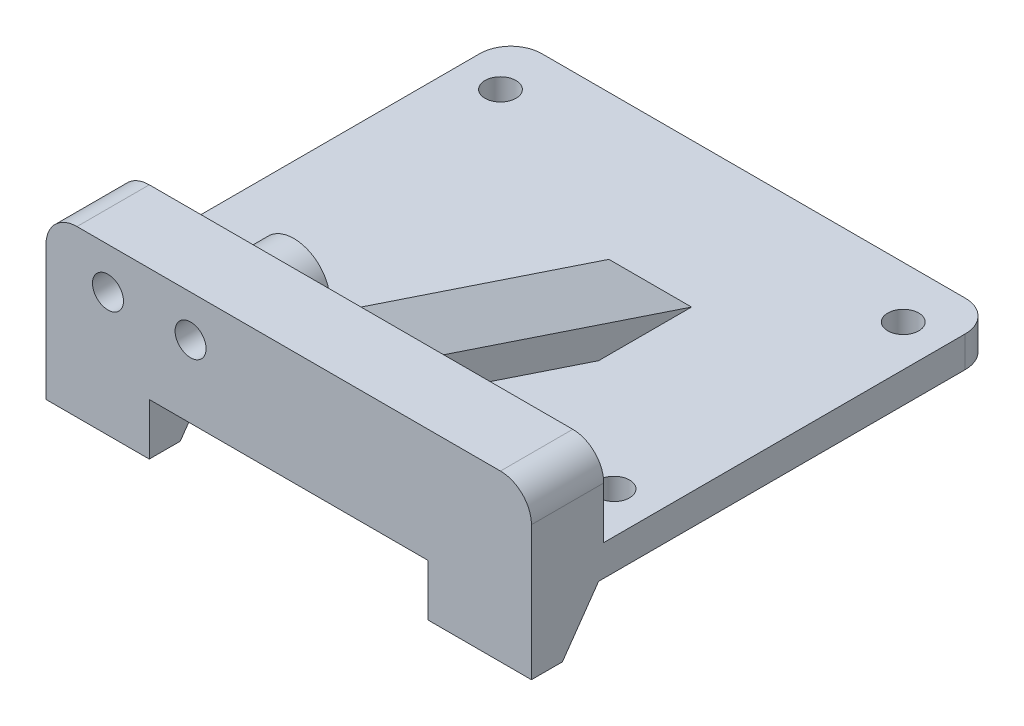
ISO-10303-21;
HEADER;
FILE_DESCRIPTION(('STEP AP214'),'2;1');
FILE_NAME('part.step','',(''),(''),'','','');
FILE_SCHEMA(('AUTOMOTIVE_DESIGN { 1 0 10303 214 1 1 1 1 }'));
ENDSEC;
DATA;
#1=APPLICATION_CONTEXT('core data for automotive mechanical design processes');
#2=APPLICATION_PROTOCOL_DEFINITION('international standard','automotive_design',2000,#1);
#3=PRODUCT_CONTEXT('',#1,'mechanical');
#4=PRODUCT('Part','Part','',(#3));
#5=PRODUCT_RELATED_PRODUCT_CATEGORY('part','',(#4));
#6=PRODUCT_DEFINITION_FORMATION('','',#4);
#7=PRODUCT_DEFINITION_CONTEXT('part definition',#1,'design');
#8=PRODUCT_DEFINITION('design','',#6,#7);
#9=PRODUCT_DEFINITION_SHAPE('','',#8);
#10=(LENGTH_UNIT() NAMED_UNIT(*) SI_UNIT(.MILLI.,.METRE.));
#11=(NAMED_UNIT(*) PLANE_ANGLE_UNIT() SI_UNIT($,.RADIAN.));
#12=(NAMED_UNIT(*) SI_UNIT($,.STERADIAN.) SOLID_ANGLE_UNIT());
#13=UNCERTAINTY_MEASURE_WITH_UNIT(LENGTH_MEASURE(1.E-05),#10,'distance_accuracy_value','');
#14=(GEOMETRIC_REPRESENTATION_CONTEXT(3) GLOBAL_UNCERTAINTY_ASSIGNED_CONTEXT((#13)) GLOBAL_UNIT_ASSIGNED_CONTEXT((#10,
#11,#12)) REPRESENTATION_CONTEXT('',''));
#15=CARTESIAN_POINT('',(0.,0.,0.));
#16=DIRECTION('',(0.,0.,1.));
#17=DIRECTION('',(1.,0.,0.));
#18=AXIS2_PLACEMENT_3D('',#15,#16,#17);
#19=CARTESIAN_POINT('',(0.,0.,19.));
#20=DIRECTION('',(0.,0.,1.));
#21=DIRECTION('',(1.,0.,0.));
#22=AXIS2_PLACEMENT_3D('',#19,#20,#21);
#23=PLANE('',#22);
#24=DIRECTION('',(0.,1.,0.));
#25=VECTOR('',#24,1.);
#26=CARTESIAN_POINT('',(-23.5,0.,19.));
#27=LINE('',#26,#25);
#28=CARTESIAN_POINT('',(-23.5,3.,19.));
#29=VERTEX_POINT('',#28);
#30=CARTESIAN_POINT('',(-23.5,8.00000000000001,19.));
#31=VERTEX_POINT('',#30);
#32=EDGE_CURVE('E273',#29,#31,#27,.T.);
#33=ORIENTED_EDGE('',*,*,#32,.T.);
#34=CARTESIAN_POINT('',(-20.5,8.00000000000001,19.));
#35=DIRECTION('',(0.,0.,1.));
#36=DIRECTION('',(1.,0.,0.));
#37=AXIS2_PLACEMENT_3D('',#34,#35,#36);
#38=CIRCLE('',#37,3.);
#39=CARTESIAN_POINT('',(-20.5,11.,19.));
#40=VERTEX_POINT('',#39);
#41=EDGE_CURVE('E350',#31,#40,#38,.F.);
#42=ORIENTED_EDGE('',*,*,#41,.T.);
#43=DIRECTION('',(1.,0.,0.));
#44=VECTOR('',#43,1.);
#45=CARTESIAN_POINT('',(0.,11.,19.));
#46=LINE('',#45,#44);
#47=CARTESIAN_POINT('',(0.,11.,19.));
#48=VERTEX_POINT('',#47);
#49=EDGE_CURVE('E282',#40,#48,#46,.T.);
#50=ORIENTED_EDGE('',*,*,#49,.T.);
#51=DIRECTION('',(0.,-1.,0.));
#52=VECTOR('',#51,1.);
#53=CARTESIAN_POINT('',(0.,11.,19.));
#54=LINE('',#53,#52);
#55=CARTESIAN_POINT('',(0.,8.,19.));
#56=VERTEX_POINT('',#55);
#57=EDGE_CURVE('E435',#48,#56,#54,.T.);
#58=ORIENTED_EDGE('',*,*,#57,.T.);
#59=DIRECTION('',(-1.,0.,0.));
#60=VECTOR('',#59,1.);
#61=CARTESIAN_POINT('',(8.,8.,19.));
#62=LINE('',#61,#60);
#63=CARTESIAN_POINT('',(8.,8.,19.));
#64=VERTEX_POINT('',#63);
#65=EDGE_CURVE('E451',#64,#56,#62,.T.);
#66=ORIENTED_EDGE('',*,*,#65,.F.);
#67=DIRECTION('',(0.,-1.,0.));
#68=VECTOR('',#67,1.);
#69=CARTESIAN_POINT('',(8.,11.,19.));
#70=LINE('',#69,#68);
#71=CARTESIAN_POINT('',(8.,11.,19.));
#72=VERTEX_POINT('',#71);
#73=EDGE_CURVE('E418',#72,#64,#70,.T.);
#74=ORIENTED_EDGE('',*,*,#73,.F.);
#75=CARTESIAN_POINT('',(20.5,11.,19.));
#76=VERTEX_POINT('',#75);
#77=EDGE_CURVE('E281',#72,#76,#46,.T.);
#78=ORIENTED_EDGE('',*,*,#77,.T.);
#79=CARTESIAN_POINT('',(20.5,7.99999999999999,19.));
#80=DIRECTION('',(0.,0.,1.));
#81=DIRECTION('',(1.,0.,0.));
#82=AXIS2_PLACEMENT_3D('',#79,#80,#81);
#83=CIRCLE('',#82,3.);
#84=CARTESIAN_POINT('',(23.5,7.99999999999999,19.));
#85=VERTEX_POINT('',#84);
#86=EDGE_CURVE('E347',#76,#85,#83,.F.);
#87=ORIENTED_EDGE('',*,*,#86,.T.);
#88=DIRECTION('',(0.,-1.,0.));
#89=VECTOR('',#88,1.);
#90=CARTESIAN_POINT('',(23.5,0.,19.));
#91=LINE('',#90,#89);
#92=CARTESIAN_POINT('',(23.5,3.,19.));
#93=VERTEX_POINT('',#92);
#94=EDGE_CURVE('E277',#85,#93,#91,.T.);
#95=ORIENTED_EDGE('',*,*,#94,.T.);
#96=DIRECTION('',(1.,0.,0.));
#97=VECTOR('',#96,1.);
#98=CARTESIAN_POINT('',(0.,3.,19.));
#99=LINE('',#98,#97);
#100=EDGE_CURVE('E297',#29,#93,#99,.T.);
#101=ORIENTED_EDGE('',*,*,#100,.F.);
#102=EDGE_LOOP('',(#33,#42,#50,#58,#66,#74,#78,#87,#95,#101));
#103=FACE_BOUND('',#102,.T.);
#104=CARTESIAN_POINT('',(-17.5,7.,19.));
#105=DIRECTION('',(0.,0.,1.));
#106=DIRECTION('',(1.,0.,0.));
#107=AXIS2_PLACEMENT_3D('',#104,#105,#106);
#108=CIRCLE('',#107,1.5);
#109=CARTESIAN_POINT('',(-16.,7.,19.));
#110=VERTEX_POINT('',#109);
#111=EDGE_CURVE('E257',#110,#110,#108,.F.);
#112=ORIENTED_EDGE('',*,*,#111,.F.);
#113=EDGE_LOOP('',(#112));
#114=FACE_BOUND('',#113,.T.);
#115=CARTESIAN_POINT('',(-9.50000000000001,7.,19.));
#116=DIRECTION('',(0.,0.,1.));
#117=DIRECTION('',(1.,0.,0.));
#118=AXIS2_PLACEMENT_3D('',#115,#116,#117);
#119=CIRCLE('',#118,3.5);
#120=CARTESIAN_POINT('',(-6.00000000000001,7.,19.));
#121=VERTEX_POINT('',#120);
#122=EDGE_CURVE('E12',#121,#121,#119,.F.);
#123=ORIENTED_EDGE('',*,*,#122,.F.);
#124=EDGE_LOOP('',(#123));
#125=FACE_BOUND('',#124,.T.);
#126=ADVANCED_FACE('F75',(#103,#114,#125),#23,.F.);
#127=CARTESIAN_POINT('',(0.,0.,0.));
#128=DIRECTION('',(0.,1.,0.));
#129=DIRECTION('',(0.,0.,1.));
#130=AXIS2_PLACEMENT_3D('',#127,#128,#129);
#131=PLANE('',#130);
#132=CARTESIAN_POINT('',(-19.5,0.,-14.));
#133=DIRECTION('',(0.,1.,0.));
#134=DIRECTION('',(0.,0.,1.));
#135=AXIS2_PLACEMENT_3D('',#132,#133,#134);
#136=CIRCLE('',#135,1.5);
#137=CARTESIAN_POINT('',(-19.5,0.,-12.5));
#138=VERTEX_POINT('',#137);
#139=EDGE_CURVE('E293',#138,#138,#136,.F.);
#140=ORIENTED_EDGE('',*,*,#139,.F.);
#141=EDGE_LOOP('',(#140));
#142=FACE_BOUND('',#141,.T.);
#143=CARTESIAN_POINT('',(-19.5,0.,14.));
#144=DIRECTION('',(0.,1.,0.));
#145=DIRECTION('',(0.,0.,1.));
#146=AXIS2_PLACEMENT_3D('',#143,#144,#145);
#147=CIRCLE('',#146,1.5);
#148=CARTESIAN_POINT('',(-19.5,0.,15.5));
#149=VERTEX_POINT('',#148);
#150=EDGE_CURVE('E337',#149,#149,#147,.T.);
#151=ORIENTED_EDGE('',*,*,#150,.T.);
#152=EDGE_LOOP('',(#151));
#153=FACE_BOUND('',#152,.T.);
#154=CARTESIAN_POINT('',(19.5,0.,-14.));
#155=DIRECTION('',(0.,1.,0.));
#156=DIRECTION('',(0.,0.,1.));
#157=AXIS2_PLACEMENT_3D('',#154,#155,#156);
#158=CIRCLE('',#157,1.5);
#159=CARTESIAN_POINT('',(19.5,0.,-12.5));
#160=VERTEX_POINT('',#159);
#161=EDGE_CURVE('E323',#160,#160,#158,.T.);
#162=ORIENTED_EDGE('',*,*,#161,.T.);
#163=EDGE_LOOP('',(#162));
#164=FACE_BOUND('',#163,.T.);
#165=CARTESIAN_POINT('',(19.5,0.,14.));
#166=DIRECTION('',(0.,1.,0.));
#167=DIRECTION('',(0.,0.,1.));
#168=AXIS2_PLACEMENT_3D('',#165,#166,#167);
#169=CIRCLE('',#168,1.5);
#170=CARTESIAN_POINT('',(19.5,0.,15.5));
#171=VERTEX_POINT('',#170);
#172=EDGE_CURVE('E272',#171,#171,#169,.F.);
#173=ORIENTED_EDGE('',*,*,#172,.F.);
#174=EDGE_LOOP('',(#173));
#175=FACE_BOUND('',#174,.T.);
#176=DIRECTION('',(1.,0.,0.));
#177=VECTOR('',#176,1.);
#178=CARTESIAN_POINT('',(0.,0.,-19.));
#179=LINE('',#178,#177);
#180=CARTESIAN_POINT('',(-20.5,0.,-19.));
#181=VERTEX_POINT('',#180);
#182=CARTESIAN_POINT('',(20.5,0.,-19.));
#183=VERTEX_POINT('',#182);
#184=EDGE_CURVE('E330',#181,#183,#179,.T.);
#185=ORIENTED_EDGE('',*,*,#184,.T.);
#186=CARTESIAN_POINT('',(20.5,0.,-16.));
#187=DIRECTION('',(0.,1.,0.));
#188=DIRECTION('',(0.,0.,1.));
#189=AXIS2_PLACEMENT_3D('',#186,#187,#188);
#190=CIRCLE('',#189,3.);
#191=CARTESIAN_POINT('',(23.5,0.,-16.));
#192=VERTEX_POINT('',#191);
#193=EDGE_CURVE('E379',#183,#192,#190,.F.);
#194=ORIENTED_EDGE('',*,*,#193,.T.);
#195=DIRECTION('',(0.,0.,-1.));
#196=VECTOR('',#195,1.);
#197=CARTESIAN_POINT('',(23.5,0.,0.));
#198=LINE('',#197,#196);
#199=CARTESIAN_POINT('',(23.5,0.,19.5));
#200=VERTEX_POINT('',#199);
#201=EDGE_CURVE('E327',#200,#192,#198,.T.);
#202=ORIENTED_EDGE('',*,*,#201,.F.);
#203=DIRECTION('',(1.,0.,0.));
#204=VECTOR('',#203,1.);
#205=CARTESIAN_POINT('',(13.5,0.,19.5));
#206=LINE('',#205,#204);
#207=CARTESIAN_POINT('',(13.5,0.,19.5));
#208=VERTEX_POINT('',#207);
#209=EDGE_CURVE('E238',#208,#200,#206,.T.);
#210=ORIENTED_EDGE('',*,*,#209,.F.);
#211=DIRECTION('',(0.,0.,-1.));
#212=VECTOR('',#211,1.);
#213=CARTESIAN_POINT('',(13.5,0.,19.5));
#214=LINE('',#213,#212);
#215=CARTESIAN_POINT('',(13.5,0.,26.));
#216=VERTEX_POINT('',#215);
#217=EDGE_CURVE('E220',#216,#208,#214,.T.);
#218=ORIENTED_EDGE('',*,*,#217,.F.);
#219=DIRECTION('',(1.,0.,0.));
#220=VECTOR('',#219,1.);
#221=CARTESIAN_POINT('',(0.,0.,26.));
#222=LINE('',#221,#220);
#223=CARTESIAN_POINT('',(-13.5,0.,26.));
#224=VERTEX_POINT('',#223);
#225=EDGE_CURVE('E235',#224,#216,#222,.T.);
#226=ORIENTED_EDGE('',*,*,#225,.F.);
#227=DIRECTION('',(0.,0.,-1.));
#228=VECTOR('',#227,1.);
#229=CARTESIAN_POINT('',(-13.5,0.,19.5));
#230=LINE('',#229,#228);
#231=CARTESIAN_POINT('',(-13.5,0.,19.5));
#232=VERTEX_POINT('',#231);
#233=EDGE_CURVE('E400',#224,#232,#230,.T.);
#234=ORIENTED_EDGE('',*,*,#233,.T.);
#235=DIRECTION('',(-1.,0.,0.));
#236=VECTOR('',#235,1.);
#237=CARTESIAN_POINT('',(-13.5,0.,19.5));
#238=LINE('',#237,#236);
#239=CARTESIAN_POINT('',(-23.5,0.,19.5));
#240=VERTEX_POINT('',#239);
#241=EDGE_CURVE('E399',#232,#240,#238,.T.);
#242=ORIENTED_EDGE('',*,*,#241,.T.);
#243=DIRECTION('',(0.,0.,-1.));
#244=VECTOR('',#243,1.);
#245=CARTESIAN_POINT('',(-23.5,0.,0.));
#246=LINE('',#245,#244);
#247=CARTESIAN_POINT('',(-23.5,0.,-16.));
#248=VERTEX_POINT('',#247);
#249=EDGE_CURVE('E333',#240,#248,#246,.T.);
#250=ORIENTED_EDGE('',*,*,#249,.T.);
#251=CARTESIAN_POINT('',(-20.5,0.,-16.));
#252=DIRECTION('',(0.,1.,0.));
#253=DIRECTION('',(0.,0.,1.));
#254=AXIS2_PLACEMENT_3D('',#251,#252,#253);
#255=CIRCLE('',#254,3.);
#256=EDGE_CURVE('E376',#248,#181,#255,.F.);
#257=ORIENTED_EDGE('',*,*,#256,.T.);
#258=EDGE_LOOP('',(#185,#194,#202,#210,#218,#226,#234,#242,#250,#257));
#259=FACE_BOUND('',#258,.T.);
#260=ADVANCED_FACE('F233',(#142,#153,#164,#175,#259),#131,.F.);
#261=CARTESIAN_POINT('',(0.,3.,0.));
#262=DIRECTION('',(0.,1.,0.));
#263=DIRECTION('',(0.,0.,1.));
#264=AXIS2_PLACEMENT_3D('',#261,#262,#263);
#265=PLANE('',#264);
#266=CARTESIAN_POINT('',(19.5,3.,14.));
#267=DIRECTION('',(0.,1.,0.));
#268=DIRECTION('',(0.,0.,1.));
#269=AXIS2_PLACEMENT_3D('',#266,#267,#268);
#270=CIRCLE('',#269,1.5);
#271=CARTESIAN_POINT('',(19.5,3.,15.5));
#272=VERTEX_POINT('',#271);
#273=EDGE_CURVE('E288',#272,#272,#270,.F.);
#274=ORIENTED_EDGE('',*,*,#273,.T.);
#275=EDGE_LOOP('',(#274));
#276=FACE_BOUND('',#275,.T.);
#277=CARTESIAN_POINT('',(19.5,3.,-14.));
#278=DIRECTION('',(0.,1.,0.));
#279=DIRECTION('',(0.,0.,1.));
#280=AXIS2_PLACEMENT_3D('',#277,#278,#279);
#281=CIRCLE('',#280,1.5);
#282=CARTESIAN_POINT('',(19.5,3.,-12.5));
#283=VERTEX_POINT('',#282);
#284=EDGE_CURVE('E292',#283,#283,#281,.T.);
#285=ORIENTED_EDGE('',*,*,#284,.F.);
#286=EDGE_LOOP('',(#285));
#287=FACE_BOUND('',#286,.T.);
#288=DIRECTION('',(0.,0.,-1.));
#289=VECTOR('',#288,1.);
#290=CARTESIAN_POINT('',(23.5,3.,0.));
#291=LINE('',#290,#289);
#292=CARTESIAN_POINT('',(23.5,3.,-16.));
#293=VERTEX_POINT('',#292);
#294=EDGE_CURVE('E301',#93,#293,#291,.T.);
#295=ORIENTED_EDGE('',*,*,#294,.T.);
#296=CARTESIAN_POINT('',(20.5,3.,-16.));
#297=DIRECTION('',(0.,1.,0.));
#298=DIRECTION('',(0.,0.,1.));
#299=AXIS2_PLACEMENT_3D('',#296,#297,#298);
#300=CIRCLE('',#299,3.);
#301=CARTESIAN_POINT('',(20.5,3.,-19.));
#302=VERTEX_POINT('',#301);
#303=EDGE_CURVE('E386',#293,#302,#300,.T.);
#304=ORIENTED_EDGE('',*,*,#303,.T.);
#305=DIRECTION('',(1.,0.,0.));
#306=VECTOR('',#305,1.);
#307=CARTESIAN_POINT('',(0.,3.,-19.));
#308=LINE('',#307,#306);
#309=CARTESIAN_POINT('',(-20.5,3.,-19.));
#310=VERTEX_POINT('',#309);
#311=EDGE_CURVE('E304',#310,#302,#308,.T.);
#312=ORIENTED_EDGE('',*,*,#311,.F.);
#313=CARTESIAN_POINT('',(-20.5,3.,-16.));
#314=DIRECTION('',(0.,1.,0.));
#315=DIRECTION('',(0.,0.,1.));
#316=AXIS2_PLACEMENT_3D('',#313,#314,#315);
#317=CIRCLE('',#316,3.);
#318=CARTESIAN_POINT('',(-23.5,3.,-16.));
#319=VERTEX_POINT('',#318);
#320=EDGE_CURVE('E91',#310,#319,#317,.T.);
#321=ORIENTED_EDGE('',*,*,#320,.T.);
#322=DIRECTION('',(0.,0.,-1.));
#323=VECTOR('',#322,1.);
#324=CARTESIAN_POINT('',(-23.5,3.,0.));
#325=LINE('',#324,#323);
#326=EDGE_CURVE('E308',#29,#319,#325,.T.);
#327=ORIENTED_EDGE('',*,*,#326,.F.);
#328=ORIENTED_EDGE('',*,*,#100,.T.);
#329=EDGE_LOOP('',(#295,#304,#312,#321,#327,#328));
#330=FACE_BOUND('',#329,.T.);
#331=CARTESIAN_POINT('',(-19.5,3.,14.));
#332=DIRECTION('',(0.,1.,0.));
#333=DIRECTION('',(0.,0.,1.));
#334=AXIS2_PLACEMENT_3D('',#331,#332,#333);
#335=CIRCLE('',#334,1.5);
#336=CARTESIAN_POINT('',(-19.5,3.,15.5));
#337=VERTEX_POINT('',#336);
#338=EDGE_CURVE('E311',#337,#337,#335,.T.);
#339=ORIENTED_EDGE('',*,*,#338,.F.);
#340=EDGE_LOOP('',(#339));
#341=FACE_BOUND('',#340,.T.);
#342=CARTESIAN_POINT('',(-19.5,3.,-14.));
#343=DIRECTION('',(0.,1.,0.));
#344=DIRECTION('',(0.,0.,1.));
#345=AXIS2_PLACEMENT_3D('',#342,#343,#344);
#346=CIRCLE('',#345,1.5);
#347=CARTESIAN_POINT('',(-19.5,3.,-12.5));
#348=VERTEX_POINT('',#347);
#349=EDGE_CURVE('E315',#348,#348,#346,.F.);
#350=ORIENTED_EDGE('',*,*,#349,.T.);
#351=EDGE_LOOP('',(#350));
#352=FACE_BOUND('',#351,.T.);
#353=DIRECTION('',(-1.,0.,0.));
#354=VECTOR('',#353,1.);
#355=CARTESIAN_POINT('',(8.,3.,-5.00000000000002));
#356=LINE('',#355,#354);
#357=CARTESIAN_POINT('',(8.,3.,-5.00000000000002));
#358=VERTEX_POINT('',#357);
#359=CARTESIAN_POINT('',(0.,3.,-5.00000000000001));
#360=VERTEX_POINT('',#359);
#361=EDGE_CURVE('E430',#358,#360,#356,.T.);
#362=ORIENTED_EDGE('',*,*,#361,.F.);
#363=DIRECTION('',(0.,0.,-1.));
#364=VECTOR('',#363,1.);
#365=CARTESIAN_POINT('',(8.,3.,-5.00000000000002));
#366=LINE('',#365,#364);
#367=CARTESIAN_POINT('',(8.,3.,3.99999999999998));
#368=VERTEX_POINT('',#367);
#369=EDGE_CURVE('E426',#368,#358,#366,.T.);
#370=ORIENTED_EDGE('',*,*,#369,.F.);
#371=DIRECTION('',(-1.,0.,0.));
#372=VECTOR('',#371,1.);
#373=CARTESIAN_POINT('',(8.,3.,3.99999999999998));
#374=LINE('',#373,#372);
#375=CARTESIAN_POINT('',(0.,3.,3.99999999999998));
#376=VERTEX_POINT('',#375);
#377=EDGE_CURVE('E448',#368,#376,#374,.T.);
#378=ORIENTED_EDGE('',*,*,#377,.T.);
#379=DIRECTION('',(0.,0.,-1.));
#380=VECTOR('',#379,1.);
#381=CARTESIAN_POINT('',(0.,3.,-5.00000000000002));
#382=LINE('',#381,#380);
#383=EDGE_CURVE('E419',#376,#360,#382,.T.);
#384=ORIENTED_EDGE('',*,*,#383,.T.);
#385=EDGE_LOOP('',(#362,#370,#378,#384));
#386=FACE_BOUND('',#385,.T.);
#387=ADVANCED_FACE('F479',(#276,#287,#330,#341,#352,#386),#265,.T.);
#388=CARTESIAN_POINT('',(23.5,3.,0.));
#389=DIRECTION('',(-1.,0.,0.));
#390=DIRECTION('',(0.,0.,1.));
#391=AXIS2_PLACEMENT_3D('',#388,#389,#390);
#392=PLANE('',#391);
#393=ORIENTED_EDGE('',*,*,#201,.T.);
#394=DIRECTION('',(0.,-1.,0.));
#395=VECTOR('',#394,1.);
#396=CARTESIAN_POINT('',(23.5,3.,-16.));
#397=LINE('',#396,#395);
#398=EDGE_CURVE('E99',#192,#293,#397,.F.);
#399=ORIENTED_EDGE('',*,*,#398,.T.);
#400=ORIENTED_EDGE('',*,*,#294,.F.);
#401=ORIENTED_EDGE('',*,*,#94,.F.);
#402=DIRECTION('',(0.,0.,-1.));
#403=VECTOR('',#402,1.);
#404=CARTESIAN_POINT('',(23.5,7.99999999999999,26.));
#405=LINE('',#404,#403);
#406=CARTESIAN_POINT('',(23.5,7.99999999999999,26.));
#407=VERTEX_POINT('',#406);
#408=EDGE_CURVE('E366',#85,#407,#405,.F.);
#409=ORIENTED_EDGE('',*,*,#408,.T.);
#410=DIRECTION('',(0.,-1.,0.));
#411=VECTOR('',#410,1.);
#412=CARTESIAN_POINT('',(23.5,0.,26.));
#413=LINE('',#412,#411);
#414=CARTESIAN_POINT('',(23.5,-5.,26.));
#415=VERTEX_POINT('',#414);
#416=EDGE_CURVE('E249',#407,#415,#413,.T.);
#417=ORIENTED_EDGE('',*,*,#416,.T.);
#418=DIRECTION('',(0.,0.,1.));
#419=VECTOR('',#418,1.);
#420=CARTESIAN_POINT('',(23.5,-5.,26.));
#421=LINE('',#420,#419);
#422=CARTESIAN_POINT('',(23.5,-5.,23.));
#423=VERTEX_POINT('',#422);
#424=EDGE_CURVE('E521',#423,#415,#421,.T.);
#425=ORIENTED_EDGE('',*,*,#424,.F.);
#426=DIRECTION('',(0.,-0.81923192051904,0.573462344363328));
#427=VECTOR('',#426,1.);
#428=CARTESIAN_POINT('',(23.5,-5.,23.));
#429=LINE('',#428,#427);
#430=EDGE_CURVE('E240',#200,#423,#429,.T.);
#431=ORIENTED_EDGE('',*,*,#430,.F.);
#432=EDGE_LOOP('',(#393,#399,#400,#401,#409,#417,#425,#431));
#433=FACE_BOUND('',#432,.T.);
#434=ADVANCED_FACE('F573',(#433),#392,.F.);
#435=CARTESIAN_POINT('',(0.,3.,-19.));
#436=DIRECTION('',(0.,0.,-1.));
#437=DIRECTION('',(-1.,0.,0.));
#438=AXIS2_PLACEMENT_3D('',#435,#436,#437);
#439=PLANE('',#438);
#440=ORIENTED_EDGE('',*,*,#311,.T.);
#441=DIRECTION('',(0.,-1.,0.));
#442=VECTOR('',#441,1.);
#443=CARTESIAN_POINT('',(20.5,0.,-19.));
#444=LINE('',#443,#442);
#445=EDGE_CURVE('E372',#302,#183,#444,.T.);
#446=ORIENTED_EDGE('',*,*,#445,.T.);
#447=ORIENTED_EDGE('',*,*,#184,.F.);
#448=DIRECTION('',(0.,-1.,0.));
#449=VECTOR('',#448,1.);
#450=CARTESIAN_POINT('',(-20.5,3.,-19.));
#451=LINE('',#450,#449);
#452=EDGE_CURVE('E369',#181,#310,#451,.F.);
#453=ORIENTED_EDGE('',*,*,#452,.T.);
#454=EDGE_LOOP('',(#440,#446,#447,#453));
#455=FACE_BOUND('',#454,.T.);
#456=ADVANCED_FACE('F583',(#455),#439,.T.);
#457=CARTESIAN_POINT('',(-19.5,3.,14.));
#458=DIRECTION('',(0.,-1.,0.));
#459=DIRECTION('',(0.,0.,-1.));
#460=AXIS2_PLACEMENT_3D('',#457,#458,#459);
#461=CYLINDRICAL_SURFACE('',#460,1.5);
#462=ORIENTED_EDGE('',*,*,#338,.T.);
#463=EDGE_LOOP('',(#462));
#464=FACE_BOUND('',#463,.T.);
#465=ORIENTED_EDGE('',*,*,#150,.F.);
#466=EDGE_LOOP('',(#465));
#467=FACE_BOUND('',#466,.T.);
#468=ADVANCED_FACE('F580',(#464,#467),#461,.F.);
#469=CARTESIAN_POINT('',(-23.5,3.,0.));
#470=DIRECTION('',(-1.,0.,0.));
#471=DIRECTION('',(0.,0.,1.));
#472=AXIS2_PLACEMENT_3D('',#469,#470,#471);
#473=PLANE('',#472);
#474=ORIENTED_EDGE('',*,*,#326,.T.);
#475=DIRECTION('',(0.,-1.,0.));
#476=VECTOR('',#475,1.);
#477=CARTESIAN_POINT('',(-23.5,3.,-16.));
#478=LINE('',#477,#476);
#479=EDGE_CURVE('E84',#319,#248,#478,.T.);
#480=ORIENTED_EDGE('',*,*,#479,.T.);
#481=ORIENTED_EDGE('',*,*,#249,.F.);
#482=DIRECTION('',(0.,-0.81923192051904,0.573462344363328));
#483=VECTOR('',#482,1.);
#484=CARTESIAN_POINT('',(-23.5,-5.,23.));
#485=LINE('',#484,#483);
#486=CARTESIAN_POINT('',(-23.5,-5.,23.));
#487=VERTEX_POINT('',#486);
#488=EDGE_CURVE('E499',#240,#487,#485,.T.);
#489=ORIENTED_EDGE('',*,*,#488,.T.);
#490=DIRECTION('',(0.,0.,1.));
#491=VECTOR('',#490,1.);
#492=CARTESIAN_POINT('',(-23.5,-5.,26.));
#493=LINE('',#492,#491);
#494=CARTESIAN_POINT('',(-23.5,-5.,26.));
#495=VERTEX_POINT('',#494);
#496=EDGE_CURVE('E489',#487,#495,#493,.T.);
#497=ORIENTED_EDGE('',*,*,#496,.T.);
#498=DIRECTION('',(0.,1.,0.));
#499=VECTOR('',#498,1.);
#500=CARTESIAN_POINT('',(-23.5,0.,26.));
#501=LINE('',#500,#499);
#502=CARTESIAN_POINT('',(-23.5,8.00000000000001,26.));
#503=VERTEX_POINT('',#502);
#504=EDGE_CURVE('E250',#495,#503,#501,.T.);
#505=ORIENTED_EDGE('',*,*,#504,.T.);
#506=DIRECTION('',(0.,0.,-1.));
#507=VECTOR('',#506,1.);
#508=CARTESIAN_POINT('',(-23.5,8.00000000000001,0.));
#509=LINE('',#508,#507);
#510=EDGE_CURVE('E319',#503,#31,#509,.T.);
#511=ORIENTED_EDGE('',*,*,#510,.T.);
#512=ORIENTED_EDGE('',*,*,#32,.F.);
#513=EDGE_LOOP('',(#474,#480,#481,#489,#497,#505,#511,#512));
#514=FACE_BOUND('',#513,.T.);
#515=ADVANCED_FACE('F393',(#514),#473,.T.);
#516=CARTESIAN_POINT('',(19.5,3.,-14.));
#517=DIRECTION('',(0.,-1.,0.));
#518=DIRECTION('',(0.,0.,-1.));
#519=AXIS2_PLACEMENT_3D('',#516,#517,#518);
#520=CYLINDRICAL_SURFACE('',#519,1.5);
#521=ORIENTED_EDGE('',*,*,#284,.T.);
#522=EDGE_LOOP('',(#521));
#523=FACE_BOUND('',#522,.T.);
#524=ORIENTED_EDGE('',*,*,#161,.F.);
#525=EDGE_LOOP('',(#524));
#526=FACE_BOUND('',#525,.T.);
#527=ADVANCED_FACE('F587',(#523,#526),#520,.F.);
#528=CARTESIAN_POINT('',(19.5,3.,14.));
#529=DIRECTION('',(0.,-1.,0.));
#530=DIRECTION('',(0.,0.,-1.));
#531=AXIS2_PLACEMENT_3D('',#528,#529,#530);
#532=CYLINDRICAL_SURFACE('',#531,1.5);
#533=ORIENTED_EDGE('',*,*,#273,.F.);
#534=EDGE_LOOP('',(#533));
#535=FACE_BOUND('',#534,.T.);
#536=ORIENTED_EDGE('',*,*,#172,.T.);
#537=EDGE_LOOP('',(#536));
#538=FACE_BOUND('',#537,.T.);
#539=ADVANCED_FACE('F578',(#535,#538),#532,.F.);
#540=CARTESIAN_POINT('',(-19.5,3.,-14.));
#541=DIRECTION('',(0.,-1.,0.));
#542=DIRECTION('',(0.,0.,-1.));
#543=AXIS2_PLACEMENT_3D('',#540,#541,#542);
#544=CYLINDRICAL_SURFACE('',#543,1.5);
#545=ORIENTED_EDGE('',*,*,#349,.F.);
#546=EDGE_LOOP('',(#545));
#547=FACE_BOUND('',#546,.T.);
#548=ORIENTED_EDGE('',*,*,#139,.T.);
#549=EDGE_LOOP('',(#548));
#550=FACE_BOUND('',#549,.T.);
#551=ADVANCED_FACE('F565',(#547,#550),#544,.F.);
#552=CARTESIAN_POINT('',(-9.50000000000001,7.,26.));
#553=DIRECTION('',(0.,0.,-1.));
#554=DIRECTION('',(-1.,0.,0.));
#555=AXIS2_PLACEMENT_3D('',#552,#553,#554);
#556=CYLINDRICAL_SURFACE('',#555,1.5);
#557=CARTESIAN_POINT('',(-9.50000000000001,7.,26.));
#558=DIRECTION('',(0.,0.,1.));
#559=DIRECTION('',(1.,0.,0.));
#560=AXIS2_PLACEMENT_3D('',#557,#558,#559);
#561=CIRCLE('',#560,1.5);
#562=CARTESIAN_POINT('',(-8.00000000000001,7.,26.));
#563=VERTEX_POINT('',#562);
#564=EDGE_CURVE('E268',#563,#563,#561,.F.);
#565=ORIENTED_EDGE('',*,*,#564,.F.);
#566=EDGE_LOOP('',(#565));
#567=FACE_BOUND('',#566,.T.);
#568=CARTESIAN_POINT('',(-9.50000000000001,7.,16.));
#569=DIRECTION('',(0.,0.,-1.));
#570=DIRECTION('',(-1.,0.,0.));
#571=AXIS2_PLACEMENT_3D('',#568,#569,#570);
#572=CIRCLE('',#571,1.5);
#573=CARTESIAN_POINT('',(-11.,7.,16.));
#574=VERTEX_POINT('',#573);
#575=EDGE_CURVE('E533',#574,#574,#572,.T.);
#576=ORIENTED_EDGE('',*,*,#575,.T.);
#577=EDGE_LOOP('',(#576));
#578=FACE_BOUND('',#577,.T.);
#579=ADVANCED_FACE('F538',(#567,#578),#556,.F.);
#580=CARTESIAN_POINT('',(-17.5,7.,26.));
#581=DIRECTION('',(0.,0.,-1.));
#582=DIRECTION('',(-1.,0.,0.));
#583=AXIS2_PLACEMENT_3D('',#580,#581,#582);
#584=CYLINDRICAL_SURFACE('',#583,1.5);
#585=CARTESIAN_POINT('',(-17.5,7.,26.));
#586=DIRECTION('',(0.,0.,1.));
#587=DIRECTION('',(1.,0.,0.));
#588=AXIS2_PLACEMENT_3D('',#585,#586,#587);
#589=CIRCLE('',#588,1.5);
#590=CARTESIAN_POINT('',(-16.,7.,26.));
#591=VERTEX_POINT('',#590);
#592=EDGE_CURVE('E264',#591,#591,#589,.F.);
#593=ORIENTED_EDGE('',*,*,#592,.F.);
#594=EDGE_LOOP('',(#593));
#595=FACE_BOUND('',#594,.T.);
#596=ORIENTED_EDGE('',*,*,#111,.T.);
#597=EDGE_LOOP('',(#596));
#598=FACE_BOUND('',#597,.T.);
#599=ADVANCED_FACE('F564',(#595,#598),#584,.F.);
#600=CARTESIAN_POINT('',(0.,11.,26.));
#601=DIRECTION('',(0.,1.,0.));
#602=DIRECTION('',(-1.,0.,0.));
#603=AXIS2_PLACEMENT_3D('',#600,#601,#602);
#604=PLANE('',#603);
#605=ORIENTED_EDGE('',*,*,#49,.F.);
#606=DIRECTION('',(0.,0.,-1.));
#607=VECTOR('',#606,1.);
#608=CARTESIAN_POINT('',(-20.5,11.,26.));
#609=LINE('',#608,#607);
#610=CARTESIAN_POINT('',(-20.5,11.,26.));
#611=VERTEX_POINT('',#610);
#612=EDGE_CURVE('E357',#40,#611,#609,.F.);
#613=ORIENTED_EDGE('',*,*,#612,.T.);
#614=DIRECTION('',(1.,0.,0.));
#615=VECTOR('',#614,1.);
#616=CARTESIAN_POINT('',(0.,11.,26.));
#617=LINE('',#616,#615);
#618=CARTESIAN_POINT('',(20.5,11.,26.));
#619=VERTEX_POINT('',#618);
#620=EDGE_CURVE('E254',#611,#619,#617,.T.);
#621=ORIENTED_EDGE('',*,*,#620,.T.);
#622=DIRECTION('',(0.,0.,-1.));
#623=VECTOR('',#622,1.);
#624=CARTESIAN_POINT('',(20.5,11.,19.));
#625=LINE('',#624,#623);
#626=EDGE_CURVE('E353',#619,#76,#625,.T.);
#627=ORIENTED_EDGE('',*,*,#626,.T.);
#628=ORIENTED_EDGE('',*,*,#77,.F.);
#629=DIRECTION('',(-1.,0.,0.));
#630=VECTOR('',#629,1.);
#631=CARTESIAN_POINT('',(8.,11.,19.));
#632=LINE('',#631,#630);
#633=EDGE_CURVE('E278',#72,#48,#632,.T.);
#634=ORIENTED_EDGE('',*,*,#633,.T.);
#635=EDGE_LOOP('',(#605,#613,#621,#627,#628,#634));
#636=FACE_BOUND('',#635,.T.);
#637=ADVANCED_FACE('F460',(#636),#604,.T.);
#638=CARTESIAN_POINT('',(0.,0.,26.));
#639=DIRECTION('',(0.,0.,1.));
#640=DIRECTION('',(1.,0.,0.));
#641=AXIS2_PLACEMENT_3D('',#638,#639,#640);
#642=PLANE('',#641);
#643=ORIENTED_EDGE('',*,*,#620,.F.);
#644=CARTESIAN_POINT('',(-20.5,8.00000000000001,26.));
#645=DIRECTION('',(0.,0.,1.));
#646=DIRECTION('',(1.,0.,0.));
#647=AXIS2_PLACEMENT_3D('',#644,#645,#646);
#648=CIRCLE('',#647,3.);
#649=EDGE_CURVE('E363',#611,#503,#648,.T.);
#650=ORIENTED_EDGE('',*,*,#649,.T.);
#651=ORIENTED_EDGE('',*,*,#504,.F.);
#652=DIRECTION('',(-1.,0.,0.));
#653=VECTOR('',#652,1.);
#654=CARTESIAN_POINT('',(-13.5,-5.,26.));
#655=LINE('',#654,#653);
#656=CARTESIAN_POINT('',(-13.5,-5.,26.));
#657=VERTEX_POINT('',#656);
#658=EDGE_CURVE('E409',#657,#495,#655,.T.);
#659=ORIENTED_EDGE('',*,*,#658,.F.);
#660=DIRECTION('',(0.,1.,0.));
#661=VECTOR('',#660,1.);
#662=CARTESIAN_POINT('',(-13.5,0.,26.));
#663=LINE('',#662,#661);
#664=EDGE_CURVE('E247',#657,#224,#663,.T.);
#665=ORIENTED_EDGE('',*,*,#664,.T.);
#666=ORIENTED_EDGE('',*,*,#225,.T.);
#667=DIRECTION('',(0.,1.,0.));
#668=VECTOR('',#667,1.);
#669=CARTESIAN_POINT('',(13.5,0.,26.));
#670=LINE('',#669,#668);
#671=CARTESIAN_POINT('',(13.5,-5.,26.));
#672=VERTEX_POINT('',#671);
#673=EDGE_CURVE('E217',#672,#216,#670,.T.);
#674=ORIENTED_EDGE('',*,*,#673,.F.);
#675=DIRECTION('',(1.,0.,0.));
#676=VECTOR('',#675,1.);
#677=CARTESIAN_POINT('',(13.5,-5.,26.));
#678=LINE('',#677,#676);
#679=EDGE_CURVE('E509',#672,#415,#678,.T.);
#680=ORIENTED_EDGE('',*,*,#679,.T.);
#681=ORIENTED_EDGE('',*,*,#416,.F.);
#682=CARTESIAN_POINT('',(20.5,7.99999999999999,26.));
#683=DIRECTION('',(0.,0.,1.));
#684=DIRECTION('',(1.,0.,0.));
#685=AXIS2_PLACEMENT_3D('',#682,#683,#684);
#686=CIRCLE('',#685,3.);
#687=EDGE_CURVE('E360',#407,#619,#686,.T.);
#688=ORIENTED_EDGE('',*,*,#687,.T.);
#689=EDGE_LOOP('',(#643,#650,#651,#659,#665,#666,#674,#680,#681,#688));
#690=FACE_BOUND('',#689,.T.);
#691=ORIENTED_EDGE('',*,*,#592,.T.);
#692=EDGE_LOOP('',(#691));
#693=FACE_BOUND('',#692,.T.);
#694=ORIENTED_EDGE('',*,*,#564,.T.);
#695=EDGE_LOOP('',(#694));
#696=FACE_BOUND('',#695,.T.);
#697=ADVANCED_FACE('F244',(#690,#693,#696),#642,.T.);
#698=CARTESIAN_POINT('',(8.,11.,19.));
#699=DIRECTION('',(0.,-0.948683298050514,0.316227766016838));
#700=DIRECTION('',(0.,-0.316227766016838,-0.948683298050514));
#701=AXIS2_PLACEMENT_3D('',#698,#699,#700);
#702=PLANE('',#701);
#703=DIRECTION('',(0.,0.316227766016838,0.948683298050514));
#704=VECTOR('',#703,1.);
#705=CARTESIAN_POINT('',(0.,11.,19.));
#706=LINE('',#705,#704);
#707=EDGE_CURVE('E431',#360,#48,#706,.T.);
#708=ORIENTED_EDGE('',*,*,#707,.T.);
#709=ORIENTED_EDGE('',*,*,#633,.F.);
#710=DIRECTION('',(0.,0.316227766016838,0.948683298050514));
#711=VECTOR('',#710,1.);
#712=CARTESIAN_POINT('',(8.,11.,19.));
#713=LINE('',#712,#711);
#714=EDGE_CURVE('E415',#358,#72,#713,.T.);
#715=ORIENTED_EDGE('',*,*,#714,.F.);
#716=ORIENTED_EDGE('',*,*,#361,.T.);
#717=EDGE_LOOP('',(#708,#709,#715,#716));
#718=FACE_BOUND('',#717,.T.);
#719=ADVANCED_FACE('F466',(#718),#702,.F.);
#720=CARTESIAN_POINT('',(8.,3.,3.99999999999998));
#721=DIRECTION('',(0.,0.948683298050514,-0.316227766016838));
#722=DIRECTION('',(0.,0.316227766016838,0.948683298050514));
#723=AXIS2_PLACEMENT_3D('',#720,#721,#722);
#724=PLANE('',#723);
#725=DIRECTION('',(0.,-0.316227766016838,-0.948683298050514));
#726=VECTOR('',#725,1.);
#727=CARTESIAN_POINT('',(0.,3.,3.99999999999998));
#728=LINE('',#727,#726);
#729=EDGE_CURVE('E439',#56,#376,#728,.T.);
#730=ORIENTED_EDGE('',*,*,#729,.T.);
#731=ORIENTED_EDGE('',*,*,#377,.F.);
#732=DIRECTION('',(0.,-0.316227766016838,-0.948683298050514));
#733=VECTOR('',#732,1.);
#734=CARTESIAN_POINT('',(8.,3.,3.99999999999998));
#735=LINE('',#734,#733);
#736=EDGE_CURVE('E422',#64,#368,#735,.T.);
#737=ORIENTED_EDGE('',*,*,#736,.F.);
#738=ORIENTED_EDGE('',*,*,#65,.T.);
#739=EDGE_LOOP('',(#730,#731,#737,#738));
#740=FACE_BOUND('',#739,.T.);
#741=ADVANCED_FACE('F476',(#740),#724,.F.);
#742=CARTESIAN_POINT('',(8.,0.,0.));
#743=DIRECTION('',(-1.,0.,0.));
#744=DIRECTION('',(0.,0.,1.));
#745=AXIS2_PLACEMENT_3D('',#742,#743,#744);
#746=PLANE('',#745);
#747=ORIENTED_EDGE('',*,*,#714,.T.);
#748=ORIENTED_EDGE('',*,*,#73,.T.);
#749=ORIENTED_EDGE('',*,*,#736,.T.);
#750=ORIENTED_EDGE('',*,*,#369,.T.);
#751=EDGE_LOOP('',(#747,#748,#749,#750));
#752=FACE_BOUND('',#751,.T.);
#753=ADVANCED_FACE('F473',(#752),#746,.F.);
#754=CARTESIAN_POINT('',(0.,0.,0.));
#755=DIRECTION('',(-1.,0.,0.));
#756=DIRECTION('',(0.,0.,1.));
#757=AXIS2_PLACEMENT_3D('',#754,#755,#756);
#758=PLANE('',#757);
#759=ORIENTED_EDGE('',*,*,#707,.F.);
#760=ORIENTED_EDGE('',*,*,#383,.F.);
#761=ORIENTED_EDGE('',*,*,#729,.F.);
#762=ORIENTED_EDGE('',*,*,#57,.F.);
#763=EDGE_LOOP('',(#759,#760,#761,#762));
#764=FACE_BOUND('',#763,.T.);
#765=ADVANCED_FACE('F482',(#764),#758,.T.);
#766=CARTESIAN_POINT('',(-20.5,8.00000000000001,0.));
#767=DIRECTION('',(0.,0.,-1.));
#768=DIRECTION('',(-1.,0.,0.));
#769=AXIS2_PLACEMENT_3D('',#766,#767,#768);
#770=CYLINDRICAL_SURFACE('',#769,3.);
#771=ORIENTED_EDGE('',*,*,#649,.F.);
#772=ORIENTED_EDGE('',*,*,#612,.F.);
#773=ORIENTED_EDGE('',*,*,#41,.F.);
#774=ORIENTED_EDGE('',*,*,#510,.F.);
#775=EDGE_LOOP('',(#771,#772,#773,#774));
#776=FACE_BOUND('',#775,.T.);
#777=ADVANCED_FACE('F486',(#776),#770,.T.);
#778=CARTESIAN_POINT('',(20.5,7.99999999999999,26.));
#779=DIRECTION('',(0.,0.,1.));
#780=DIRECTION('',(1.,0.,0.));
#781=AXIS2_PLACEMENT_3D('',#778,#779,#780);
#782=CYLINDRICAL_SURFACE('',#781,3.);
#783=ORIENTED_EDGE('',*,*,#687,.F.);
#784=ORIENTED_EDGE('',*,*,#408,.F.);
#785=ORIENTED_EDGE('',*,*,#86,.F.);
#786=ORIENTED_EDGE('',*,*,#626,.F.);
#787=EDGE_LOOP('',(#783,#784,#785,#786));
#788=FACE_BOUND('',#787,.T.);
#789=ADVANCED_FACE('F601',(#788),#782,.T.);
#790=CARTESIAN_POINT('',(-13.5,-5.,26.));
#791=DIRECTION('',(0.,-1.,0.));
#792=DIRECTION('',(0.,0.,-1.));
#793=AXIS2_PLACEMENT_3D('',#790,#791,#792);
#794=PLANE('',#793);
#795=ORIENTED_EDGE('',*,*,#496,.F.);
#796=DIRECTION('',(-1.,0.,0.));
#797=VECTOR('',#796,1.);
#798=CARTESIAN_POINT('',(-13.5,-5.,23.));
#799=LINE('',#798,#797);
#800=CARTESIAN_POINT('',(-13.5,-5.,23.));
#801=VERTEX_POINT('',#800);
#802=EDGE_CURVE('E405',#801,#487,#799,.T.);
#803=ORIENTED_EDGE('',*,*,#802,.F.);
#804=DIRECTION('',(0.,0.,1.));
#805=VECTOR('',#804,1.);
#806=CARTESIAN_POINT('',(-13.5,-5.,26.));
#807=LINE('',#806,#805);
#808=EDGE_CURVE('E411',#801,#657,#807,.T.);
#809=ORIENTED_EDGE('',*,*,#808,.T.);
#810=ORIENTED_EDGE('',*,*,#658,.T.);
#811=EDGE_LOOP('',(#795,#803,#809,#810));
#812=FACE_BOUND('',#811,.T.);
#813=ADVANCED_FACE('F493',(#812),#794,.T.);
#814=CARTESIAN_POINT('',(-13.5,-5.,23.));
#815=DIRECTION('',(0.,-0.573462344363328,-0.81923192051904));
#816=DIRECTION('',(0.,0.81923192051904,-0.573462344363328));
#817=AXIS2_PLACEMENT_3D('',#814,#815,#816);
#818=PLANE('',#817);
#819=ORIENTED_EDGE('',*,*,#488,.F.);
#820=ORIENTED_EDGE('',*,*,#241,.F.);
#821=DIRECTION('',(0.,-0.81923192051904,0.573462344363328));
#822=VECTOR('',#821,1.);
#823=CARTESIAN_POINT('',(-13.5,-5.,23.));
#824=LINE('',#823,#822);
#825=EDGE_CURVE('E504',#232,#801,#824,.T.);
#826=ORIENTED_EDGE('',*,*,#825,.T.);
#827=ORIENTED_EDGE('',*,*,#802,.T.);
#828=EDGE_LOOP('',(#819,#820,#826,#827));
#829=FACE_BOUND('',#828,.T.);
#830=ADVANCED_FACE('F635',(#829),#818,.T.);
#831=CARTESIAN_POINT('',(-13.5,0.,0.));
#832=DIRECTION('',(1.,0.,0.));
#833=DIRECTION('',(0.,0.,-1.));
#834=AXIS2_PLACEMENT_3D('',#831,#832,#833);
#835=PLANE('',#834);
#836=ORIENTED_EDGE('',*,*,#233,.F.);
#837=ORIENTED_EDGE('',*,*,#664,.F.);
#838=ORIENTED_EDGE('',*,*,#808,.F.);
#839=ORIENTED_EDGE('',*,*,#825,.F.);
#840=EDGE_LOOP('',(#836,#837,#838,#839));
#841=FACE_BOUND('',#840,.T.);
#842=ADVANCED_FACE('F630',(#841),#835,.T.);
#843=CARTESIAN_POINT('',(13.5,-5.,23.));
#844=DIRECTION('',(0.,0.573462344363328,0.81923192051904));
#845=DIRECTION('',(0.,-0.81923192051904,0.573462344363328));
#846=AXIS2_PLACEMENT_3D('',#843,#844,#845);
#847=PLANE('',#846);
#848=ORIENTED_EDGE('',*,*,#430,.T.);
#849=DIRECTION('',(1.,0.,0.));
#850=VECTOR('',#849,1.);
#851=CARTESIAN_POINT('',(13.5,-5.,23.));
#852=LINE('',#851,#850);
#853=CARTESIAN_POINT('',(13.5,-5.,23.));
#854=VERTEX_POINT('',#853);
#855=EDGE_CURVE('E512',#854,#423,#852,.T.);
#856=ORIENTED_EDGE('',*,*,#855,.F.);
#857=DIRECTION('',(0.,-0.81923192051904,0.573462344363328));
#858=VECTOR('',#857,1.);
#859=CARTESIAN_POINT('',(13.5,-5.,23.));
#860=LINE('',#859,#858);
#861=EDGE_CURVE('E513',#208,#854,#860,.T.);
#862=ORIENTED_EDGE('',*,*,#861,.F.);
#863=ORIENTED_EDGE('',*,*,#209,.T.);
#864=EDGE_LOOP('',(#848,#856,#862,#863));
#865=FACE_BOUND('',#864,.T.);
#866=ADVANCED_FACE('F618',(#865),#847,.F.);
#867=CARTESIAN_POINT('',(13.5,-5.,26.));
#868=DIRECTION('',(0.,1.,0.));
#869=DIRECTION('',(0.,0.,1.));
#870=AXIS2_PLACEMENT_3D('',#867,#868,#869);
#871=PLANE('',#870);
#872=ORIENTED_EDGE('',*,*,#424,.T.);
#873=ORIENTED_EDGE('',*,*,#679,.F.);
#874=DIRECTION('',(0.,0.,1.));
#875=VECTOR('',#874,1.);
#876=CARTESIAN_POINT('',(13.5,-5.,26.));
#877=LINE('',#876,#875);
#878=EDGE_CURVE('E223',#854,#672,#877,.T.);
#879=ORIENTED_EDGE('',*,*,#878,.F.);
#880=ORIENTED_EDGE('',*,*,#855,.T.);
#881=EDGE_LOOP('',(#872,#873,#879,#880));
#882=FACE_BOUND('',#881,.T.);
#883=ADVANCED_FACE('F609',(#882),#871,.F.);
#884=CARTESIAN_POINT('',(13.5,0.,0.));
#885=DIRECTION('',(-1.,0.,0.));
#886=DIRECTION('',(0.,0.,-1.));
#887=AXIS2_PLACEMENT_3D('',#884,#885,#886);
#888=PLANE('',#887);
#889=ORIENTED_EDGE('',*,*,#217,.T.);
#890=ORIENTED_EDGE('',*,*,#861,.T.);
#891=ORIENTED_EDGE('',*,*,#878,.T.);
#892=ORIENTED_EDGE('',*,*,#673,.T.);
#893=EDGE_LOOP('',(#889,#890,#891,#892));
#894=FACE_BOUND('',#893,.T.);
#895=ADVANCED_FACE('F219',(#894),#888,.T.);
#896=CARTESIAN_POINT('',(20.5,3.,-16.));
#897=DIRECTION('',(0.,1.,0.));
#898=DIRECTION('',(0.,0.,1.));
#899=AXIS2_PLACEMENT_3D('',#896,#897,#898);
#900=CYLINDRICAL_SURFACE('',#899,3.);
#901=ORIENTED_EDGE('',*,*,#303,.F.);
#902=ORIENTED_EDGE('',*,*,#398,.F.);
#903=ORIENTED_EDGE('',*,*,#193,.F.);
#904=ORIENTED_EDGE('',*,*,#445,.F.);
#905=EDGE_LOOP('',(#901,#902,#903,#904));
#906=FACE_BOUND('',#905,.T.);
#907=ADVANCED_FACE('F551',(#906),#900,.T.);
#908=CARTESIAN_POINT('',(-20.5,3.,-16.));
#909=DIRECTION('',(0.,-1.,0.));
#910=DIRECTION('',(0.,0.,-1.));
#911=AXIS2_PLACEMENT_3D('',#908,#909,#910);
#912=CYLINDRICAL_SURFACE('',#911,3.);
#913=ORIENTED_EDGE('',*,*,#320,.F.);
#914=ORIENTED_EDGE('',*,*,#452,.F.);
#915=ORIENTED_EDGE('',*,*,#256,.F.);
#916=ORIENTED_EDGE('',*,*,#479,.F.);
#917=EDGE_LOOP('',(#913,#914,#915,#916));
#918=FACE_BOUND('',#917,.T.);
#919=ADVANCED_FACE('F77',(#918),#912,.T.);
#920=CARTESIAN_POINT('',(-9.50000000000001,7.,16.));
#921=DIRECTION('',(0.,0.,-1.));
#922=DIRECTION('',(-1.,0.,0.));
#923=AXIS2_PLACEMENT_3D('',#920,#921,#922);
#924=PLANE('',#923);
#925=CARTESIAN_POINT('',(-9.50000000000001,7.,16.));
#926=DIRECTION('',(0.,0.,-1.));
#927=DIRECTION('',(-1.,0.,0.));
#928=AXIS2_PLACEMENT_3D('',#925,#926,#927);
#929=CIRCLE('',#928,3.5);
#930=CARTESIAN_POINT('',(-13.,7.,16.));
#931=VERTEX_POINT('',#930);
#932=EDGE_CURVE('E525',#931,#931,#929,.T.);
#933=ORIENTED_EDGE('',*,*,#932,.T.);
#934=EDGE_LOOP('',(#933));
#935=FACE_BOUND('',#934,.T.);
#936=ORIENTED_EDGE('',*,*,#575,.F.);
#937=EDGE_LOOP('',(#936));
#938=FACE_BOUND('',#937,.T.);
#939=ADVANCED_FACE('F540',(#935,#938),#924,.T.);
#940=CARTESIAN_POINT('',(-9.50000000000001,7.,16.));
#941=DIRECTION('',(0.,0.,1.));
#942=DIRECTION('',(1.,0.,0.));
#943=AXIS2_PLACEMENT_3D('',#940,#941,#942);
#944=CYLINDRICAL_SURFACE('',#943,3.5);
#945=ORIENTED_EDGE('',*,*,#932,.F.);
#946=EDGE_LOOP('',(#945));
#947=FACE_BOUND('',#946,.T.);
#948=ORIENTED_EDGE('',*,*,#122,.T.);
#949=EDGE_LOOP('',(#948));
#950=FACE_BOUND('',#949,.T.);
#951=ADVANCED_FACE('F542',(#947,#950),#944,.T.);
#952=CLOSED_SHELL('',(#126,#260,#387,#434,#456,#468,#515,#527,#539,#551,#579,#599,#637,#697,
#719,#741,#753,#765,#777,#789,#813,#830,#842,#866,#883,#895,#907,#919,#939,#951));
#953=MANIFOLD_SOLID_BREP('B2',#952);
#954=ADVANCED_BREP_SHAPE_REPRESENTATION('',(#18,#953),#14);
#955=SHAPE_DEFINITION_REPRESENTATION(#9,#954);
ENDSEC;
END-ISO-10303-21;
